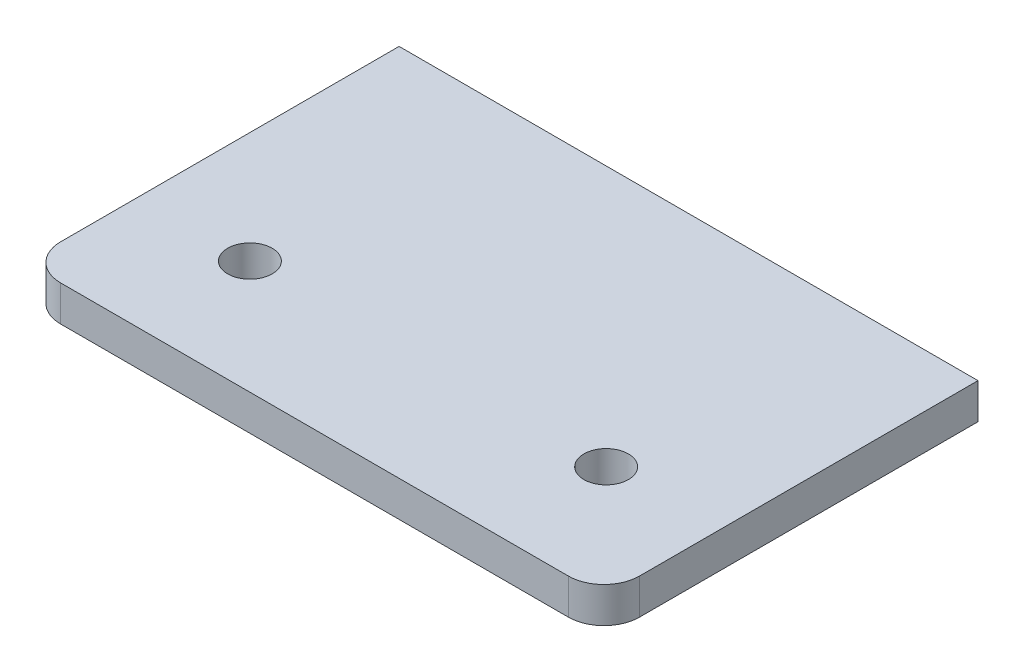
ISO-10303-21;
HEADER;
FILE_DESCRIPTION(('STEP AP214'),'2;1');
FILE_NAME('part.step','',(''),(''),'','','');
FILE_SCHEMA(('AUTOMOTIVE_DESIGN { 1 0 10303 214 1 1 1 1 }'));
ENDSEC;
DATA;
#1=APPLICATION_CONTEXT('core data for automotive mechanical design processes');
#2=APPLICATION_PROTOCOL_DEFINITION('international standard','automotive_design',2000,#1);
#3=PRODUCT_CONTEXT('',#1,'mechanical');
#4=PRODUCT('Part','Part','',(#3));
#5=PRODUCT_RELATED_PRODUCT_CATEGORY('part','',(#4));
#6=PRODUCT_DEFINITION_FORMATION('','',#4);
#7=PRODUCT_DEFINITION_CONTEXT('part definition',#1,'design');
#8=PRODUCT_DEFINITION('design','',#6,#7);
#9=PRODUCT_DEFINITION_SHAPE('','',#8);
#10=(LENGTH_UNIT() NAMED_UNIT(*) SI_UNIT(.MILLI.,.METRE.));
#11=(NAMED_UNIT(*) PLANE_ANGLE_UNIT() SI_UNIT($,.RADIAN.));
#12=(NAMED_UNIT(*) SI_UNIT($,.STERADIAN.) SOLID_ANGLE_UNIT());
#13=UNCERTAINTY_MEASURE_WITH_UNIT(LENGTH_MEASURE(1.E-05),#10,'distance_accuracy_value','');
#14=(GEOMETRIC_REPRESENTATION_CONTEXT(3) GLOBAL_UNCERTAINTY_ASSIGNED_CONTEXT((#13)) GLOBAL_UNIT_ASSIGNED_CONTEXT((#10,
#11,#12)) REPRESENTATION_CONTEXT('',''));
#15=CARTESIAN_POINT('',(0.,0.,0.));
#16=DIRECTION('',(0.,0.,1.));
#17=DIRECTION('',(1.,0.,0.));
#18=AXIS2_PLACEMENT_3D('',#15,#16,#17);
#19=CARTESIAN_POINT('',(4.,4.,-4.));
#20=DIRECTION('',(0.,1.,0.));
#21=DIRECTION('',(0.,0.,1.));
#22=AXIS2_PLACEMENT_3D('',#19,#20,#21);
#23=PLANE('',#22);
#24=CARTESIAN_POINT('',(12.5,4.,-12.75));
#25=DIRECTION('',(0.,1.,0.));
#26=DIRECTION('',(0.,0.,1.));
#27=AXIS2_PLACEMENT_3D('',#24,#25,#26);
#28=CIRCLE('',#27,2.5);
#29=CARTESIAN_POINT('',(12.5,4.,-10.25));
#30=VERTEX_POINT('',#29);
#31=EDGE_CURVE('E128',#30,#30,#28,.T.);
#32=ORIENTED_EDGE('',*,*,#31,.F.);
#33=EDGE_LOOP('',(#32));
#34=FACE_BOUND('',#33,.T.);
#35=DIRECTION('',(0.,0.,-1.));
#36=VECTOR('',#35,1.);
#37=CARTESIAN_POINT('',(65.,4.,-4.00000000000003));
#38=LINE('',#37,#36);
#39=CARTESIAN_POINT('',(65.,4.,-4.00000000000003));
#40=VERTEX_POINT('',#39);
#41=CARTESIAN_POINT('',(65.,4.,-42.));
#42=VERTEX_POINT('',#41);
#43=EDGE_CURVE('E135',#40,#42,#38,.T.);
#44=ORIENTED_EDGE('',*,*,#43,.T.);
#45=DIRECTION('',(-1.,0.,0.));
#46=VECTOR('',#45,1.);
#47=CARTESIAN_POINT('',(0.,4.,-42.));
#48=LINE('',#47,#46);
#49=CARTESIAN_POINT('',(0.,4.,-42.));
#50=VERTEX_POINT('',#49);
#51=EDGE_CURVE('E93',#42,#50,#48,.T.);
#52=ORIENTED_EDGE('',*,*,#51,.T.);
#53=DIRECTION('',(0.,0.,1.));
#54=VECTOR('',#53,1.);
#55=CARTESIAN_POINT('',(0.,4.,-4.00000000000003));
#56=LINE('',#55,#54);
#57=CARTESIAN_POINT('',(0.,4.,-4.00000000000003));
#58=VERTEX_POINT('',#57);
#59=EDGE_CURVE('E106',#50,#58,#56,.T.);
#60=ORIENTED_EDGE('',*,*,#59,.T.);
#61=CARTESIAN_POINT('',(4.,4.,-4.));
#62=DIRECTION('',(0.,1.,0.));
#63=DIRECTION('',(0.,0.,1.));
#64=AXIS2_PLACEMENT_3D('',#61,#62,#63);
#65=CIRCLE('',#64,4.);
#66=CARTESIAN_POINT('',(4.,4.,0.));
#67=VERTEX_POINT('',#66);
#68=EDGE_CURVE('E100',#58,#67,#65,.T.);
#69=ORIENTED_EDGE('',*,*,#68,.T.);
#70=DIRECTION('',(1.,0.,0.));
#71=VECTOR('',#70,1.);
#72=CARTESIAN_POINT('',(4.00000000000003,4.,0.));
#73=LINE('',#72,#71);
#74=CARTESIAN_POINT('',(61.,4.,0.));
#75=VERTEX_POINT('',#74);
#76=EDGE_CURVE('E104',#67,#75,#73,.T.);
#77=ORIENTED_EDGE('',*,*,#76,.T.);
#78=CARTESIAN_POINT('',(61.,4.,-4.));
#79=DIRECTION('',(0.,1.,0.));
#80=DIRECTION('',(0.,0.,-1.));
#81=AXIS2_PLACEMENT_3D('',#78,#79,#80);
#82=CIRCLE('',#81,4.);
#83=EDGE_CURVE('E56',#75,#40,#82,.T.);
#84=ORIENTED_EDGE('',*,*,#83,.T.);
#85=EDGE_LOOP('',(#44,#52,#60,#69,#77,#84));
#86=FACE_BOUND('',#85,.T.);
#87=CARTESIAN_POINT('',(52.5,4.,-12.75));
#88=DIRECTION('',(0.,1.,0.));
#89=DIRECTION('',(0.,0.,1.));
#90=AXIS2_PLACEMENT_3D('',#87,#88,#89);
#91=CIRCLE('',#90,2.5);
#92=CARTESIAN_POINT('',(52.5,4.,-10.25));
#93=VERTEX_POINT('',#92);
#94=EDGE_CURVE('E177',#93,#93,#91,.T.);
#95=ORIENTED_EDGE('',*,*,#94,.F.);
#96=EDGE_LOOP('',(#95));
#97=FACE_BOUND('',#96,.T.);
#98=ADVANCED_FACE('F39',(#34,#86,#97),#23,.T.);
#99=CARTESIAN_POINT('',(4.,0.,-4.));
#100=DIRECTION('',(0.,1.,0.));
#101=DIRECTION('',(0.,0.,1.));
#102=AXIS2_PLACEMENT_3D('',#99,#100,#101);
#103=PLANE('',#102);
#104=DIRECTION('',(0.,0.,-1.));
#105=VECTOR('',#104,1.);
#106=CARTESIAN_POINT('',(65.,0.,-4.00000000000003));
#107=LINE('',#106,#105);
#108=CARTESIAN_POINT('',(65.,0.,-4.00000000000003));
#109=VERTEX_POINT('',#108);
#110=CARTESIAN_POINT('',(65.,0.,-42.));
#111=VERTEX_POINT('',#110);
#112=EDGE_CURVE('E124',#109,#111,#107,.T.);
#113=ORIENTED_EDGE('',*,*,#112,.F.);
#114=CARTESIAN_POINT('',(61.,0.,-4.));
#115=DIRECTION('',(0.,1.,0.));
#116=DIRECTION('',(0.,0.,-1.));
#117=AXIS2_PLACEMENT_3D('',#114,#115,#116);
#118=CIRCLE('',#117,4.);
#119=CARTESIAN_POINT('',(61.,0.,0.));
#120=VERTEX_POINT('',#119);
#121=EDGE_CURVE('E85',#120,#109,#118,.T.);
#122=ORIENTED_EDGE('',*,*,#121,.F.);
#123=DIRECTION('',(1.,0.,0.));
#124=VECTOR('',#123,1.);
#125=CARTESIAN_POINT('',(4.00000000000003,0.,0.));
#126=LINE('',#125,#124);
#127=CARTESIAN_POINT('',(4.,0.,0.));
#128=VERTEX_POINT('',#127);
#129=EDGE_CURVE('E79',#128,#120,#126,.T.);
#130=ORIENTED_EDGE('',*,*,#129,.F.);
#131=CARTESIAN_POINT('',(4.,0.,-4.));
#132=DIRECTION('',(0.,1.,0.));
#133=DIRECTION('',(0.,0.,1.));
#134=AXIS2_PLACEMENT_3D('',#131,#132,#133);
#135=CIRCLE('',#134,4.);
#136=CARTESIAN_POINT('',(0.,0.,-4.00000000000003));
#137=VERTEX_POINT('',#136);
#138=EDGE_CURVE('E114',#137,#128,#135,.T.);
#139=ORIENTED_EDGE('',*,*,#138,.F.);
#140=DIRECTION('',(0.,0.,1.));
#141=VECTOR('',#140,1.);
#142=CARTESIAN_POINT('',(0.,0.,-4.00000000000003));
#143=LINE('',#142,#141);
#144=CARTESIAN_POINT('',(0.,0.,-42.));
#145=VERTEX_POINT('',#144);
#146=EDGE_CURVE('E130',#145,#137,#143,.T.);
#147=ORIENTED_EDGE('',*,*,#146,.F.);
#148=DIRECTION('',(-1.,0.,0.));
#149=VECTOR('',#148,1.);
#150=CARTESIAN_POINT('',(0.,0.,-42.));
#151=LINE('',#150,#149);
#152=EDGE_CURVE('E127',#111,#145,#151,.T.);
#153=ORIENTED_EDGE('',*,*,#152,.F.);
#154=EDGE_LOOP('',(#113,#122,#130,#139,#147,#153));
#155=FACE_BOUND('',#154,.T.);
#156=CARTESIAN_POINT('',(12.5,0.,-12.75));
#157=DIRECTION('',(0.,1.,0.));
#158=DIRECTION('',(0.,0.,1.));
#159=AXIS2_PLACEMENT_3D('',#156,#157,#158);
#160=CIRCLE('',#159,2.5);
#161=CARTESIAN_POINT('',(12.5,0.,-10.25));
#162=VERTEX_POINT('',#161);
#163=EDGE_CURVE('E183',#162,#162,#160,.T.);
#164=ORIENTED_EDGE('',*,*,#163,.T.);
#165=EDGE_LOOP('',(#164));
#166=FACE_BOUND('',#165,.T.);
#167=CARTESIAN_POINT('',(52.5,0.,-12.75));
#168=DIRECTION('',(0.,1.,0.));
#169=DIRECTION('',(0.,0.,1.));
#170=AXIS2_PLACEMENT_3D('',#167,#168,#169);
#171=CIRCLE('',#170,2.5);
#172=CARTESIAN_POINT('',(52.5,0.,-10.25));
#173=VERTEX_POINT('',#172);
#174=EDGE_CURVE('E180',#173,#173,#171,.T.);
#175=ORIENTED_EDGE('',*,*,#174,.T.);
#176=EDGE_LOOP('',(#175));
#177=FACE_BOUND('',#176,.T.);
#178=ADVANCED_FACE('F144',(#155,#166,#177),#103,.F.);
#179=CARTESIAN_POINT('',(65.,4.,-4.00000000000003));
#180=DIRECTION('',(-1.,0.,0.));
#181=DIRECTION('',(0.,0.,1.));
#182=AXIS2_PLACEMENT_3D('',#179,#180,#181);
#183=PLANE('',#182);
#184=ORIENTED_EDGE('',*,*,#112,.T.);
#185=DIRECTION('',(0.,-1.,0.));
#186=VECTOR('',#185,1.);
#187=CARTESIAN_POINT('',(65.,4.,-42.));
#188=LINE('',#187,#186);
#189=EDGE_CURVE('E11',#42,#111,#188,.T.);
#190=ORIENTED_EDGE('',*,*,#189,.F.);
#191=ORIENTED_EDGE('',*,*,#43,.F.);
#192=DIRECTION('',(0.,-1.,0.));
#193=VECTOR('',#192,1.);
#194=CARTESIAN_POINT('',(65.,4.,-4.00000000000003));
#195=LINE('',#194,#193);
#196=EDGE_CURVE('E120',#40,#109,#195,.T.);
#197=ORIENTED_EDGE('',*,*,#196,.T.);
#198=EDGE_LOOP('',(#184,#190,#191,#197));
#199=FACE_BOUND('',#198,.T.);
#200=ADVANCED_FACE('F41',(#199),#183,.F.);
#201=CARTESIAN_POINT('',(0.,4.,-42.));
#202=DIRECTION('',(0.,0.,1.));
#203=DIRECTION('',(1.,0.,0.));
#204=AXIS2_PLACEMENT_3D('',#201,#202,#203);
#205=PLANE('',#204);
#206=ORIENTED_EDGE('',*,*,#152,.T.);
#207=DIRECTION('',(0.,-1.,0.));
#208=VECTOR('',#207,1.);
#209=CARTESIAN_POINT('',(0.,4.,-42.));
#210=LINE('',#209,#208);
#211=EDGE_CURVE('E48',#50,#145,#210,.T.);
#212=ORIENTED_EDGE('',*,*,#211,.F.);
#213=ORIENTED_EDGE('',*,*,#51,.F.);
#214=ORIENTED_EDGE('',*,*,#189,.T.);
#215=EDGE_LOOP('',(#206,#212,#213,#214));
#216=FACE_BOUND('',#215,.T.);
#217=ADVANCED_FACE('F228',(#216),#205,.F.);
#218=CARTESIAN_POINT('',(0.,4.,-4.00000000000003));
#219=DIRECTION('',(1.,0.,0.));
#220=DIRECTION('',(0.,0.,-1.));
#221=AXIS2_PLACEMENT_3D('',#218,#219,#220);
#222=PLANE('',#221);
#223=ORIENTED_EDGE('',*,*,#146,.T.);
#224=DIRECTION('',(0.,-1.,0.));
#225=VECTOR('',#224,1.);
#226=CARTESIAN_POINT('',(0.,4.,-4.00000000000003));
#227=LINE('',#226,#225);
#228=EDGE_CURVE('E115',#58,#137,#227,.T.);
#229=ORIENTED_EDGE('',*,*,#228,.F.);
#230=ORIENTED_EDGE('',*,*,#59,.F.);
#231=ORIENTED_EDGE('',*,*,#211,.T.);
#232=EDGE_LOOP('',(#223,#229,#230,#231));
#233=FACE_BOUND('',#232,.T.);
#234=ADVANCED_FACE('F141',(#233),#222,.F.);
#235=CARTESIAN_POINT('',(4.,4.,-4.));
#236=DIRECTION('',(0.,-1.,0.));
#237=DIRECTION('',(0.,0.,-1.));
#238=AXIS2_PLACEMENT_3D('',#235,#236,#237);
#239=CYLINDRICAL_SURFACE('',#238,4.);
#240=ORIENTED_EDGE('',*,*,#138,.T.);
#241=DIRECTION('',(0.,-1.,0.));
#242=VECTOR('',#241,1.);
#243=CARTESIAN_POINT('',(4.,4.,0.));
#244=LINE('',#243,#242);
#245=EDGE_CURVE('E111',#67,#128,#244,.T.);
#246=ORIENTED_EDGE('',*,*,#245,.F.);
#247=ORIENTED_EDGE('',*,*,#68,.F.);
#248=ORIENTED_EDGE('',*,*,#228,.T.);
#249=EDGE_LOOP('',(#240,#246,#247,#248));
#250=FACE_BOUND('',#249,.T.);
#251=ADVANCED_FACE('F112',(#250),#239,.T.);
#252=CARTESIAN_POINT('',(4.00000000000003,4.,0.));
#253=DIRECTION('',(0.,0.,-1.));
#254=DIRECTION('',(-1.,0.,0.));
#255=AXIS2_PLACEMENT_3D('',#252,#253,#254);
#256=PLANE('',#255);
#257=ORIENTED_EDGE('',*,*,#129,.T.);
#258=DIRECTION('',(0.,-1.,0.));
#259=VECTOR('',#258,1.);
#260=CARTESIAN_POINT('',(61.,4.,0.));
#261=LINE('',#260,#259);
#262=EDGE_CURVE('E116',#75,#120,#261,.T.);
#263=ORIENTED_EDGE('',*,*,#262,.F.);
#264=ORIENTED_EDGE('',*,*,#76,.F.);
#265=ORIENTED_EDGE('',*,*,#245,.T.);
#266=EDGE_LOOP('',(#257,#263,#264,#265));
#267=FACE_BOUND('',#266,.T.);
#268=ADVANCED_FACE('F118',(#267),#256,.F.);
#269=CARTESIAN_POINT('',(61.,4.,-4.));
#270=DIRECTION('',(0.,-1.,0.));
#271=DIRECTION('',(0.,0.,-1.));
#272=AXIS2_PLACEMENT_3D('',#269,#270,#271);
#273=CYLINDRICAL_SURFACE('',#272,4.);
#274=ORIENTED_EDGE('',*,*,#121,.T.);
#275=ORIENTED_EDGE('',*,*,#196,.F.);
#276=ORIENTED_EDGE('',*,*,#83,.F.);
#277=ORIENTED_EDGE('',*,*,#262,.T.);
#278=EDGE_LOOP('',(#274,#275,#276,#277));
#279=FACE_BOUND('',#278,.T.);
#280=ADVANCED_FACE('F149',(#279),#273,.T.);
#281=CARTESIAN_POINT('',(12.5,4.,-12.75));
#282=DIRECTION('',(0.,-1.,0.));
#283=DIRECTION('',(0.,0.,-1.));
#284=AXIS2_PLACEMENT_3D('',#281,#282,#283);
#285=CYLINDRICAL_SURFACE('',#284,2.5);
#286=ORIENTED_EDGE('',*,*,#31,.T.);
#287=EDGE_LOOP('',(#286));
#288=FACE_BOUND('',#287,.T.);
#289=ORIENTED_EDGE('',*,*,#163,.F.);
#290=EDGE_LOOP('',(#289));
#291=FACE_BOUND('',#290,.T.);
#292=ADVANCED_FACE('F151',(#288,#291),#285,.F.);
#293=CARTESIAN_POINT('',(52.5,4.,-12.75));
#294=DIRECTION('',(0.,-1.,0.));
#295=DIRECTION('',(0.,0.,-1.));
#296=AXIS2_PLACEMENT_3D('',#293,#294,#295);
#297=CYLINDRICAL_SURFACE('',#296,2.5);
#298=ORIENTED_EDGE('',*,*,#94,.T.);
#299=EDGE_LOOP('',(#298));
#300=FACE_BOUND('',#299,.T.);
#301=ORIENTED_EDGE('',*,*,#174,.F.);
#302=EDGE_LOOP('',(#301));
#303=FACE_BOUND('',#302,.T.);
#304=ADVANCED_FACE('F157',(#300,#303),#297,.F.);
#305=CLOSED_SHELL('',(#98,#178,#200,#217,#234,#251,#268,#280,#292,#304));
#306=MANIFOLD_SOLID_BREP('B2',#305);
#307=ADVANCED_BREP_SHAPE_REPRESENTATION('',(#18,#306),#14);
#308=SHAPE_DEFINITION_REPRESENTATION(#9,#307);
ENDSEC;
END-ISO-10303-21;
